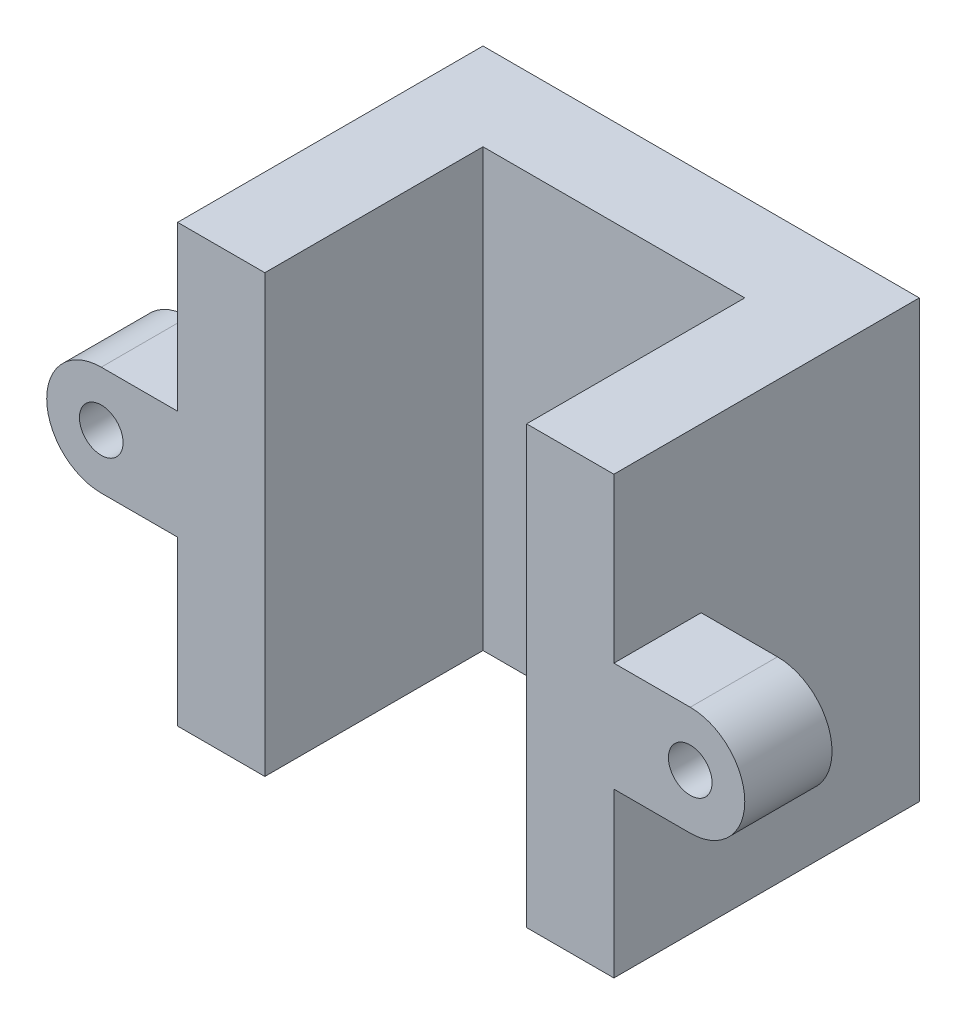
ISO-10303-21;
HEADER;
FILE_DESCRIPTION(('STEP AP214'),'2;1');
FILE_NAME('part.step','',(''),(''),'','','');
FILE_SCHEMA(('AUTOMOTIVE_DESIGN { 1 0 10303 214 1 1 1 1 }'));
ENDSEC;
DATA;
#1=APPLICATION_CONTEXT('core data for automotive mechanical design processes');
#2=APPLICATION_PROTOCOL_DEFINITION('international standard','automotive_design',2000,#1);
#3=PRODUCT_CONTEXT('',#1,'mechanical');
#4=PRODUCT('Part','Part','',(#3));
#5=PRODUCT_RELATED_PRODUCT_CATEGORY('part','',(#4));
#6=PRODUCT_DEFINITION_FORMATION('','',#4);
#7=PRODUCT_DEFINITION_CONTEXT('part definition',#1,'design');
#8=PRODUCT_DEFINITION('design','',#6,#7);
#9=PRODUCT_DEFINITION_SHAPE('','',#8);
#10=(LENGTH_UNIT() NAMED_UNIT(*) SI_UNIT(.MILLI.,.METRE.));
#11=(NAMED_UNIT(*) PLANE_ANGLE_UNIT() SI_UNIT($,.RADIAN.));
#12=(NAMED_UNIT(*) SI_UNIT($,.STERADIAN.) SOLID_ANGLE_UNIT());
#13=UNCERTAINTY_MEASURE_WITH_UNIT(LENGTH_MEASURE(1.E-05),#10,'distance_accuracy_value','');
#14=(GEOMETRIC_REPRESENTATION_CONTEXT(3) GLOBAL_UNCERTAINTY_ASSIGNED_CONTEXT((#13)) GLOBAL_UNIT_ASSIGNED_CONTEXT((#10,
#11,#12)) REPRESENTATION_CONTEXT('',''));
#15=CARTESIAN_POINT('',(0.,0.,0.));
#16=DIRECTION('',(0.,0.,1.));
#17=DIRECTION('',(1.,0.,0.));
#18=AXIS2_PLACEMENT_3D('',#15,#16,#17);
#19=CARTESIAN_POINT('',(-16.,4.,0.999999999999997));
#20=DIRECTION('',(0.,0.,-1.));
#21=DIRECTION('',(0.,1.,0.));
#22=AXIS2_PLACEMENT_3D('',#19,#20,#21);
#23=PLANE('',#22);
#24=CARTESIAN_POINT('',(-13.5,10.,0.999999999999998));
#25=DIRECTION('',(0.,0.,1.));
#26=DIRECTION('',(0.,1.,0.));
#27=AXIS2_PLACEMENT_3D('',#24,#25,#26);
#28=CIRCLE('',#27,2.5);
#29=CARTESIAN_POINT('',(-13.5,12.5,0.999999999999998));
#30=VERTEX_POINT('',#29);
#31=CARTESIAN_POINT('',(-13.5,7.5,0.999999999999998));
#32=VERTEX_POINT('',#31);
#33=EDGE_CURVE('E360',#30,#32,#28,.T.);
#34=ORIENTED_EDGE('',*,*,#33,.F.);
#35=DIRECTION('',(1.,0.,0.));
#36=VECTOR('',#35,1.);
#37=CARTESIAN_POINT('',(0.,12.5,0.999999999999998));
#38=LINE('',#37,#36);
#39=CARTESIAN_POINT('',(-10.,12.5,0.999999999999998));
#40=VERTEX_POINT('',#39);
#41=EDGE_CURVE('E346',#30,#40,#38,.T.);
#42=ORIENTED_EDGE('',*,*,#41,.T.);
#43=DIRECTION('',(0.,1.,0.));
#44=VECTOR('',#43,1.);
#45=CARTESIAN_POINT('',(-10.,4.,0.999999999999997));
#46=LINE('',#45,#44);
#47=CARTESIAN_POINT('',(-10.,7.5,0.999999999999998));
#48=VERTEX_POINT('',#47);
#49=EDGE_CURVE('E374',#48,#40,#46,.T.);
#50=ORIENTED_EDGE('',*,*,#49,.F.);
#51=DIRECTION('',(1.,0.,0.));
#52=VECTOR('',#51,1.);
#53=CARTESIAN_POINT('',(0.,7.5,0.999999999999998));
#54=LINE('',#53,#52);
#55=EDGE_CURVE('E363',#32,#48,#54,.T.);
#56=ORIENTED_EDGE('',*,*,#55,.F.);
#57=EDGE_LOOP('',(#34,#42,#50,#56));
#58=FACE_BOUND('',#57,.T.);
#59=DIRECTION('',(0.,1.,0.));
#60=VECTOR('',#59,1.);
#61=CARTESIAN_POINT('',(-11.9844555433772,9.12500000000001,0.999999999999998));
#62=LINE('',#61,#60);
#63=CARTESIAN_POINT('',(-11.9844555433772,9.12500000000001,0.999999999999998));
#64=VERTEX_POINT('',#63);
#65=CARTESIAN_POINT('',(-11.9844555433772,10.875,0.999999999999998));
#66=VERTEX_POINT('',#65);
#67=EDGE_CURVE('E327',#64,#66,#62,.T.);
#68=ORIENTED_EDGE('',*,*,#67,.T.);
#69=DIRECTION('',(-0.866025403784442,0.499999999999995,0.));
#70=VECTOR('',#69,1.);
#71=CARTESIAN_POINT('',(-11.9844555433772,10.875,0.999999999999998));
#72=LINE('',#71,#70);
#73=CARTESIAN_POINT('',(-13.5,11.75,0.999999999999998));
#74=VERTEX_POINT('',#73);
#75=EDGE_CURVE('E124',#66,#74,#72,.T.);
#76=ORIENTED_EDGE('',*,*,#75,.T.);
#77=DIRECTION('',(-0.866025403784438,-0.500000000000001,0.));
#78=VECTOR('',#77,1.);
#79=CARTESIAN_POINT('',(-13.5,11.75,0.999999999999998));
#80=LINE('',#79,#78);
#81=CARTESIAN_POINT('',(-15.0155444566228,10.875,0.999999999999998));
#82=VERTEX_POINT('',#81);
#83=EDGE_CURVE('E314',#74,#82,#80,.T.);
#84=ORIENTED_EDGE('',*,*,#83,.T.);
#85=DIRECTION('',(0.,-1.,0.));
#86=VECTOR('',#85,1.);
#87=CARTESIAN_POINT('',(-15.0155444566228,10.875,0.999999999999998));
#88=LINE('',#87,#86);
#89=CARTESIAN_POINT('',(-15.0155444566228,9.12499999999999,0.999999999999998));
#90=VERTEX_POINT('',#89);
#91=EDGE_CURVE('E317',#82,#90,#88,.T.);
#92=ORIENTED_EDGE('',*,*,#91,.T.);
#93=DIRECTION('',(0.866025403784441,-0.499999999999996,0.));
#94=VECTOR('',#93,1.);
#95=CARTESIAN_POINT('',(-15.0155444566228,9.12499999999999,0.999999999999998));
#96=LINE('',#95,#94);
#97=CARTESIAN_POINT('',(-13.5,8.25,0.999999999999998));
#98=VERTEX_POINT('',#97);
#99=EDGE_CURVE('E332',#90,#98,#96,.T.);
#100=ORIENTED_EDGE('',*,*,#99,.T.);
#101=DIRECTION('',(0.866025403784434,0.500000000000007,0.));
#102=VECTOR('',#101,1.);
#103=CARTESIAN_POINT('',(-13.5,8.25,0.999999999999998));
#104=LINE('',#103,#102);
#105=EDGE_CURVE('E329',#98,#64,#104,.T.);
#106=ORIENTED_EDGE('',*,*,#105,.T.);
#107=EDGE_LOOP('',(#68,#76,#84,#92,#100,#106));
#108=FACE_BOUND('',#107,.T.);
#109=ADVANCED_FACE('F107',(#58,#108),#23,.T.);
#110=CARTESIAN_POINT('',(-13.5,10.,7.));
#111=DIRECTION('',(0.,0.,-1.));
#112=DIRECTION('',(0.,1.,0.));
#113=AXIS2_PLACEMENT_3D('',#110,#111,#112);
#114=CYLINDRICAL_SURFACE('',#113,1.);
#115=CARTESIAN_POINT('',(-13.5,10.,5.));
#116=DIRECTION('',(0.,0.,1.));
#117=DIRECTION('',(1.,0.,0.));
#118=AXIS2_PLACEMENT_3D('',#115,#116,#117);
#119=CIRCLE('',#118,1.);
#120=CARTESIAN_POINT('',(-12.5,10.,5.));
#121=VERTEX_POINT('',#120);
#122=EDGE_CURVE('E353',#121,#121,#119,.F.);
#123=ORIENTED_EDGE('',*,*,#122,.F.);
#124=EDGE_LOOP('',(#123));
#125=FACE_BOUND('',#124,.T.);
#126=CARTESIAN_POINT('',(-13.5,10.,3.));
#127=DIRECTION('',(0.,0.,-1.));
#128=DIRECTION('',(-1.,0.,0.));
#129=AXIS2_PLACEMENT_3D('',#126,#127,#128);
#130=CIRCLE('',#129,1.);
#131=CARTESIAN_POINT('',(-14.5,10.,3.));
#132=VERTEX_POINT('',#131);
#133=EDGE_CURVE('E111',#132,#132,#130,.T.);
#134=ORIENTED_EDGE('',*,*,#133,.T.);
#135=EDGE_LOOP('',(#134));
#136=FACE_BOUND('',#135,.T.);
#137=ADVANCED_FACE('F538',(#125,#136),#114,.F.);
#138=CARTESIAN_POINT('',(0.,20.,5.));
#139=DIRECTION('',(0.,0.,1.));
#140=DIRECTION('',(1.,0.,0.));
#141=AXIS2_PLACEMENT_3D('',#138,#139,#140);
#142=PLANE('',#141);
#143=ORIENTED_EDGE('',*,*,#122,.T.);
#144=EDGE_LOOP('',(#143));
#145=FACE_BOUND('',#144,.T.);
#146=DIRECTION('',(-1.,0.,0.));
#147=VECTOR('',#146,1.);
#148=CARTESIAN_POINT('',(0.,12.5,5.));
#149=LINE('',#148,#147);
#150=CARTESIAN_POINT('',(-10.,12.5,5.));
#151=VERTEX_POINT('',#150);
#152=CARTESIAN_POINT('',(-13.5,12.5,5.));
#153=VERTEX_POINT('',#152);
#154=EDGE_CURVE('E357',#151,#153,#149,.T.);
#155=ORIENTED_EDGE('',*,*,#154,.T.);
#156=CARTESIAN_POINT('',(-13.5,10.,5.));
#157=DIRECTION('',(0.,0.,1.));
#158=DIRECTION('',(1.,0.,0.));
#159=AXIS2_PLACEMENT_3D('',#156,#157,#158);
#160=CIRCLE('',#159,2.5);
#161=CARTESIAN_POINT('',(-13.5,7.5,5.));
#162=VERTEX_POINT('',#161);
#163=EDGE_CURVE('E369',#162,#153,#160,.F.);
#164=ORIENTED_EDGE('',*,*,#163,.F.);
#165=DIRECTION('',(-1.,0.,0.));
#166=VECTOR('',#165,1.);
#167=CARTESIAN_POINT('',(0.,7.5,5.));
#168=LINE('',#167,#166);
#169=CARTESIAN_POINT('',(-10.,7.5,5.));
#170=VERTEX_POINT('',#169);
#171=EDGE_CURVE('E372',#170,#162,#168,.T.);
#172=ORIENTED_EDGE('',*,*,#171,.F.);
#173=DIRECTION('',(0.,-1.,0.));
#174=VECTOR('',#173,1.);
#175=CARTESIAN_POINT('',(-10.,20.,5.));
#176=LINE('',#175,#174);
#177=CARTESIAN_POINT('',(-10.,0.,5.));
#178=VERTEX_POINT('',#177);
#179=EDGE_CURVE('E478',#170,#178,#176,.T.);
#180=ORIENTED_EDGE('',*,*,#179,.T.);
#181=DIRECTION('',(-1.,0.,0.));
#182=VECTOR('',#181,1.);
#183=CARTESIAN_POINT('',(0.,0.,5.));
#184=LINE('',#183,#182);
#185=CARTESIAN_POINT('',(-6.,0.,5.));
#186=VERTEX_POINT('',#185);
#187=EDGE_CURVE('E456',#186,#178,#184,.T.);
#188=ORIENTED_EDGE('',*,*,#187,.F.);
#189=DIRECTION('',(0.,-1.,0.));
#190=VECTOR('',#189,1.);
#191=CARTESIAN_POINT('',(-6.,20.,5.));
#192=LINE('',#191,#190);
#193=CARTESIAN_POINT('',(-6.,20.,5.));
#194=VERTEX_POINT('',#193);
#195=EDGE_CURVE('E12',#194,#186,#192,.T.);
#196=ORIENTED_EDGE('',*,*,#195,.F.);
#197=DIRECTION('',(-1.,0.,0.));
#198=VECTOR('',#197,1.);
#199=CARTESIAN_POINT('',(0.,20.,5.));
#200=LINE('',#199,#198);
#201=CARTESIAN_POINT('',(-10.,20.,5.));
#202=VERTEX_POINT('',#201);
#203=EDGE_CURVE('E457',#194,#202,#200,.T.);
#204=ORIENTED_EDGE('',*,*,#203,.T.);
#205=EDGE_CURVE('E500',#202,#151,#176,.T.);
#206=ORIENTED_EDGE('',*,*,#205,.T.);
#207=EDGE_LOOP('',(#155,#164,#172,#180,#188,#196,#204,#206));
#208=FACE_BOUND('',#207,.T.);
#209=ADVANCED_FACE('F109',(#145,#208),#142,.T.);
#210=CARTESIAN_POINT('',(-10.,20.,0.));
#211=DIRECTION('',(-1.,0.,0.));
#212=DIRECTION('',(0.,0.,1.));
#213=AXIS2_PLACEMENT_3D('',#210,#211,#212);
#214=PLANE('',#213);
#215=DIRECTION('',(0.,0.,-1.));
#216=VECTOR('',#215,1.);
#217=CARTESIAN_POINT('',(-10.,7.5,7.));
#218=LINE('',#217,#216);
#219=EDGE_CURVE('E367',#170,#48,#218,.T.);
#220=ORIENTED_EDGE('',*,*,#219,.T.);
#221=ORIENTED_EDGE('',*,*,#49,.T.);
#222=DIRECTION('',(0.,0.,-1.));
#223=VECTOR('',#222,1.);
#224=CARTESIAN_POINT('',(-10.,12.5,7.));
#225=LINE('',#224,#223);
#226=EDGE_CURVE('E349',#151,#40,#225,.T.);
#227=ORIENTED_EDGE('',*,*,#226,.F.);
#228=ORIENTED_EDGE('',*,*,#205,.F.);
#229=DIRECTION('',(0.,0.,-1.));
#230=VECTOR('',#229,1.);
#231=CARTESIAN_POINT('',(-10.,20.,0.));
#232=LINE('',#231,#230);
#233=CARTESIAN_POINT('',(-10.,20.,-9.));
#234=VERTEX_POINT('',#233);
#235=EDGE_CURVE('E475',#202,#234,#232,.T.);
#236=ORIENTED_EDGE('',*,*,#235,.T.);
#237=DIRECTION('',(0.,-1.,0.));
#238=VECTOR('',#237,1.);
#239=CARTESIAN_POINT('',(-10.,20.,-9.));
#240=LINE('',#239,#238);
#241=CARTESIAN_POINT('',(-10.,0.,-9.));
#242=VERTEX_POINT('',#241);
#243=EDGE_CURVE('E502',#234,#242,#240,.T.);
#244=ORIENTED_EDGE('',*,*,#243,.T.);
#245=DIRECTION('',(0.,0.,-1.));
#246=VECTOR('',#245,1.);
#247=CARTESIAN_POINT('',(-10.,0.,0.));
#248=LINE('',#247,#246);
#249=EDGE_CURVE('E461',#178,#242,#248,.T.);
#250=ORIENTED_EDGE('',*,*,#249,.F.);
#251=ORIENTED_EDGE('',*,*,#179,.F.);
#252=EDGE_LOOP('',(#220,#221,#227,#228,#236,#244,#250,#251));
#253=FACE_BOUND('',#252,.T.);
#254=ADVANCED_FACE('F522',(#253),#214,.T.);
#255=CARTESIAN_POINT('',(13.5,10.,7.));
#256=DIRECTION('',(0.,0.,-1.));
#257=DIRECTION('',(0.,1.,0.));
#258=AXIS2_PLACEMENT_3D('',#255,#256,#257);
#259=CYLINDRICAL_SURFACE('',#258,1.);
#260=CARTESIAN_POINT('',(13.5,10.,5.));
#261=DIRECTION('',(0.,0.,-1.));
#262=DIRECTION('',(-1.,0.,0.));
#263=AXIS2_PLACEMENT_3D('',#260,#261,#262);
#264=CIRCLE('',#263,1.);
#265=CARTESIAN_POINT('',(12.5,10.,5.));
#266=VERTEX_POINT('',#265);
#267=EDGE_CURVE('E435',#266,#266,#264,.T.);
#268=ORIENTED_EDGE('',*,*,#267,.F.);
#269=EDGE_LOOP('',(#268));
#270=FACE_BOUND('',#269,.T.);
#271=CARTESIAN_POINT('',(13.5,10.,3.));
#272=DIRECTION('',(0.,0.,-1.));
#273=DIRECTION('',(-1.,0.,0.));
#274=AXIS2_PLACEMENT_3D('',#271,#272,#273);
#275=CIRCLE('',#274,1.);
#276=CARTESIAN_POINT('',(12.5,10.,3.));
#277=VERTEX_POINT('',#276);
#278=EDGE_CURVE('E414',#277,#277,#275,.F.);
#279=ORIENTED_EDGE('',*,*,#278,.F.);
#280=EDGE_LOOP('',(#279));
#281=FACE_BOUND('',#280,.T.);
#282=ADVANCED_FACE('F519',(#270,#281),#259,.F.);
#283=CARTESIAN_POINT('',(0.,20.,5.));
#284=DIRECTION('',(0.,0.,-1.));
#285=DIRECTION('',(-1.,0.,0.));
#286=AXIS2_PLACEMENT_3D('',#283,#284,#285);
#287=PLANE('',#286);
#288=ORIENTED_EDGE('',*,*,#267,.T.);
#289=EDGE_LOOP('',(#288));
#290=FACE_BOUND('',#289,.T.);
#291=CARTESIAN_POINT('',(13.5,10.,5.));
#292=DIRECTION('',(0.,0.,-1.));
#293=DIRECTION('',(-1.,0.,0.));
#294=AXIS2_PLACEMENT_3D('',#291,#292,#293);
#295=CIRCLE('',#294,2.5);
#296=CARTESIAN_POINT('',(13.5,12.5,5.));
#297=VERTEX_POINT('',#296);
#298=CARTESIAN_POINT('',(13.5,7.5,5.));
#299=VERTEX_POINT('',#298);
#300=EDGE_CURVE('E447',#297,#299,#295,.T.);
#301=ORIENTED_EDGE('',*,*,#300,.F.);
#302=DIRECTION('',(-1.,0.,0.));
#303=VECTOR('',#302,1.);
#304=CARTESIAN_POINT('',(0.,12.5,5.));
#305=LINE('',#304,#303);
#306=CARTESIAN_POINT('',(10.,12.5,5.));
#307=VERTEX_POINT('',#306);
#308=EDGE_CURVE('E430',#297,#307,#305,.T.);
#309=ORIENTED_EDGE('',*,*,#308,.T.);
#310=DIRECTION('',(0.,-1.,0.));
#311=VECTOR('',#310,1.);
#312=CARTESIAN_POINT('',(10.,20.,5.));
#313=LINE('',#312,#311);
#314=CARTESIAN_POINT('',(10.,20.,5.));
#315=VERTEX_POINT('',#314);
#316=EDGE_CURVE('E507',#315,#307,#313,.T.);
#317=ORIENTED_EDGE('',*,*,#316,.F.);
#318=DIRECTION('',(1.,0.,0.));
#319=VECTOR('',#318,1.);
#320=CARTESIAN_POINT('',(0.,20.,5.));
#321=LINE('',#320,#319);
#322=CARTESIAN_POINT('',(6.,20.,5.));
#323=VERTEX_POINT('',#322);
#324=EDGE_CURVE('E468',#323,#315,#321,.T.);
#325=ORIENTED_EDGE('',*,*,#324,.F.);
#326=DIRECTION('',(0.,-1.,0.));
#327=VECTOR('',#326,1.);
#328=CARTESIAN_POINT('',(6.,20.,5.));
#329=LINE('',#328,#327);
#330=CARTESIAN_POINT('',(6.,0.,5.));
#331=VERTEX_POINT('',#330);
#332=EDGE_CURVE('E509',#323,#331,#329,.T.);
#333=ORIENTED_EDGE('',*,*,#332,.T.);
#334=DIRECTION('',(1.,0.,0.));
#335=VECTOR('',#334,1.);
#336=CARTESIAN_POINT('',(0.,0.,5.));
#337=LINE('',#336,#335);
#338=CARTESIAN_POINT('',(10.,0.,5.));
#339=VERTEX_POINT('',#338);
#340=EDGE_CURVE('E489',#331,#339,#337,.T.);
#341=ORIENTED_EDGE('',*,*,#340,.T.);
#342=CARTESIAN_POINT('',(10.,7.5,5.));
#343=VERTEX_POINT('',#342);
#344=EDGE_CURVE('E506',#343,#339,#313,.T.);
#345=ORIENTED_EDGE('',*,*,#344,.F.);
#346=DIRECTION('',(-1.,0.,0.));
#347=VECTOR('',#346,1.);
#348=CARTESIAN_POINT('',(0.,7.5,5.));
#349=LINE('',#348,#347);
#350=EDGE_CURVE('E450',#299,#343,#349,.T.);
#351=ORIENTED_EDGE('',*,*,#350,.F.);
#352=EDGE_LOOP('',(#301,#309,#317,#325,#333,#341,#345,#351));
#353=FACE_BOUND('',#352,.T.);
#354=ADVANCED_FACE('F521',(#290,#353),#287,.F.);
#355=CARTESIAN_POINT('',(16.,4.,0.999999999999997));
#356=DIRECTION('',(0.,0.,1.));
#357=DIRECTION('',(0.,-1.,0.));
#358=AXIS2_PLACEMENT_3D('',#355,#356,#357);
#359=PLANE('',#358);
#360=DIRECTION('',(0.866025403784438,-0.500000000000001,0.));
#361=VECTOR('',#360,1.);
#362=CARTESIAN_POINT('',(13.5,11.75,0.999999999999998));
#363=LINE('',#362,#361);
#364=CARTESIAN_POINT('',(13.5,11.75,0.999999999999997));
#365=VERTEX_POINT('',#364);
#366=CARTESIAN_POINT('',(15.0155444566228,10.875,0.999999999999998));
#367=VERTEX_POINT('',#366);
#368=EDGE_CURVE('E398',#365,#367,#363,.T.);
#369=ORIENTED_EDGE('',*,*,#368,.F.);
#370=DIRECTION('',(0.866025403784442,0.499999999999995,0.));
#371=VECTOR('',#370,1.);
#372=CARTESIAN_POINT('',(11.9844555433772,10.875,0.999999999999998));
#373=LINE('',#372,#371);
#374=CARTESIAN_POINT('',(11.9844555433772,10.875,0.999999999999998));
#375=VERTEX_POINT('',#374);
#376=EDGE_CURVE('E132',#375,#365,#373,.T.);
#377=ORIENTED_EDGE('',*,*,#376,.F.);
#378=DIRECTION('',(0.,1.,0.));
#379=VECTOR('',#378,1.);
#380=CARTESIAN_POINT('',(11.9844555433772,9.12500000000001,0.999999999999998));
#381=LINE('',#380,#379);
#382=CARTESIAN_POINT('',(11.9844555433772,9.12500000000001,0.999999999999998));
#383=VERTEX_POINT('',#382);
#384=EDGE_CURVE('E381',#383,#375,#381,.T.);
#385=ORIENTED_EDGE('',*,*,#384,.F.);
#386=DIRECTION('',(-0.866025403784434,0.500000000000007,0.));
#387=VECTOR('',#386,1.);
#388=CARTESIAN_POINT('',(13.5,8.25,0.999999999999998));
#389=LINE('',#388,#387);
#390=CARTESIAN_POINT('',(13.5,8.25,0.999999999999998));
#391=VERTEX_POINT('',#390);
#392=EDGE_CURVE('E407',#391,#383,#389,.T.);
#393=ORIENTED_EDGE('',*,*,#392,.F.);
#394=DIRECTION('',(-0.866025403784441,-0.499999999999996,0.));
#395=VECTOR('',#394,1.);
#396=CARTESIAN_POINT('',(15.0155444566228,9.12499999999999,0.999999999999998));
#397=LINE('',#396,#395);
#398=CARTESIAN_POINT('',(15.0155444566228,9.12499999999999,0.999999999999998));
#399=VERTEX_POINT('',#398);
#400=EDGE_CURVE('E404',#399,#391,#397,.T.);
#401=ORIENTED_EDGE('',*,*,#400,.F.);
#402=DIRECTION('',(0.,-1.,0.));
#403=VECTOR('',#402,1.);
#404=CARTESIAN_POINT('',(15.0155444566228,10.875,0.999999999999998));
#405=LINE('',#404,#403);
#406=EDGE_CURVE('E401',#367,#399,#405,.T.);
#407=ORIENTED_EDGE('',*,*,#406,.F.);
#408=EDGE_LOOP('',(#369,#377,#385,#393,#401,#407));
#409=FACE_BOUND('',#408,.T.);
#410=DIRECTION('',(-1.,0.,0.));
#411=VECTOR('',#410,1.);
#412=CARTESIAN_POINT('',(0.,12.5,0.999999999999998));
#413=LINE('',#412,#411);
#414=CARTESIAN_POINT('',(13.5,12.5,0.999999999999998));
#415=VERTEX_POINT('',#414);
#416=CARTESIAN_POINT('',(10.,12.5,0.999999999999998));
#417=VERTEX_POINT('',#416);
#418=EDGE_CURVE('E424',#415,#417,#413,.T.);
#419=ORIENTED_EDGE('',*,*,#418,.F.);
#420=CARTESIAN_POINT('',(13.5,10.,0.999999999999998));
#421=DIRECTION('',(0.,0.,-1.));
#422=DIRECTION('',(0.,1.,0.));
#423=AXIS2_PLACEMENT_3D('',#420,#421,#422);
#424=CIRCLE('',#423,2.5);
#425=CARTESIAN_POINT('',(13.5,7.5,0.999999999999998));
#426=VERTEX_POINT('',#425);
#427=EDGE_CURVE('E438',#415,#426,#424,.T.);
#428=ORIENTED_EDGE('',*,*,#427,.T.);
#429=DIRECTION('',(-1.,0.,0.));
#430=VECTOR('',#429,1.);
#431=CARTESIAN_POINT('',(0.,7.5,0.999999999999998));
#432=LINE('',#431,#430);
#433=CARTESIAN_POINT('',(10.,7.5,0.999999999999998));
#434=VERTEX_POINT('',#433);
#435=EDGE_CURVE('E441',#426,#434,#432,.T.);
#436=ORIENTED_EDGE('',*,*,#435,.T.);
#437=DIRECTION('',(0.,1.,0.));
#438=VECTOR('',#437,1.);
#439=CARTESIAN_POINT('',(10.,4.,0.999999999999997));
#440=LINE('',#439,#438);
#441=EDGE_CURVE('E453',#434,#417,#440,.T.);
#442=ORIENTED_EDGE('',*,*,#441,.T.);
#443=EDGE_LOOP('',(#419,#428,#436,#442));
#444=FACE_BOUND('',#443,.T.);
#445=ADVANCED_FACE('F529',(#409,#444),#359,.F.);
#446=CARTESIAN_POINT('',(10.,20.,0.));
#447=DIRECTION('',(-1.,0.,0.));
#448=DIRECTION('',(0.,0.,1.));
#449=AXIS2_PLACEMENT_3D('',#446,#447,#448);
#450=PLANE('',#449);
#451=ORIENTED_EDGE('',*,*,#441,.F.);
#452=DIRECTION('',(0.,0.,-1.));
#453=VECTOR('',#452,1.);
#454=CARTESIAN_POINT('',(10.,7.5,7.));
#455=LINE('',#454,#453);
#456=EDGE_CURVE('E444',#343,#434,#455,.T.);
#457=ORIENTED_EDGE('',*,*,#456,.F.);
#458=ORIENTED_EDGE('',*,*,#344,.T.);
#459=DIRECTION('',(0.,0.,-1.));
#460=VECTOR('',#459,1.);
#461=CARTESIAN_POINT('',(10.,0.,0.));
#462=LINE('',#461,#460);
#463=CARTESIAN_POINT('',(10.,0.,-9.));
#464=VERTEX_POINT('',#463);
#465=EDGE_CURVE('E492',#339,#464,#462,.T.);
#466=ORIENTED_EDGE('',*,*,#465,.T.);
#467=DIRECTION('',(0.,-1.,0.));
#468=VECTOR('',#467,1.);
#469=CARTESIAN_POINT('',(10.,20.,-9.));
#470=LINE('',#469,#468);
#471=CARTESIAN_POINT('',(10.,20.,-9.));
#472=VERTEX_POINT('',#471);
#473=EDGE_CURVE('E504',#472,#464,#470,.T.);
#474=ORIENTED_EDGE('',*,*,#473,.F.);
#475=DIRECTION('',(0.,0.,-1.));
#476=VECTOR('',#475,1.);
#477=CARTESIAN_POINT('',(10.,20.,0.));
#478=LINE('',#477,#476);
#479=EDGE_CURVE('E470',#315,#472,#478,.T.);
#480=ORIENTED_EDGE('',*,*,#479,.F.);
#481=ORIENTED_EDGE('',*,*,#316,.T.);
#482=DIRECTION('',(0.,0.,-1.));
#483=VECTOR('',#482,1.);
#484=CARTESIAN_POINT('',(10.,12.5,7.));
#485=LINE('',#484,#483);
#486=EDGE_CURVE('E428',#307,#417,#485,.T.);
#487=ORIENTED_EDGE('',*,*,#486,.T.);
#488=EDGE_LOOP('',(#451,#457,#458,#466,#474,#480,#481,#487));
#489=FACE_BOUND('',#488,.T.);
#490=ADVANCED_FACE('F595',(#489),#450,.F.);
#491=CARTESIAN_POINT('',(-6.,20.,0.));
#492=DIRECTION('',(-1.,0.,0.));
#493=DIRECTION('',(0.,0.,1.));
#494=AXIS2_PLACEMENT_3D('',#491,#492,#493);
#495=PLANE('',#494);
#496=DIRECTION('',(0.,0.,-1.));
#497=VECTOR('',#496,1.);
#498=CARTESIAN_POINT('',(-6.,0.,0.));
#499=LINE('',#498,#497);
#500=CARTESIAN_POINT('',(-6.,0.,-5.));
#501=VERTEX_POINT('',#500);
#502=EDGE_CURVE('E481',#186,#501,#499,.T.);
#503=ORIENTED_EDGE('',*,*,#502,.T.);
#504=DIRECTION('',(0.,-1.,0.));
#505=VECTOR('',#504,1.);
#506=CARTESIAN_POINT('',(-6.,20.,-5.));
#507=LINE('',#506,#505);
#508=CARTESIAN_POINT('',(-6.,20.,-5.));
#509=VERTEX_POINT('',#508);
#510=EDGE_CURVE('E116',#509,#501,#507,.T.);
#511=ORIENTED_EDGE('',*,*,#510,.F.);
#512=DIRECTION('',(0.,0.,-1.));
#513=VECTOR('',#512,1.);
#514=CARTESIAN_POINT('',(-6.,20.,0.));
#515=LINE('',#514,#513);
#516=EDGE_CURVE('E460',#194,#509,#515,.T.);
#517=ORIENTED_EDGE('',*,*,#516,.F.);
#518=ORIENTED_EDGE('',*,*,#195,.T.);
#519=EDGE_LOOP('',(#503,#511,#517,#518));
#520=FACE_BOUND('',#519,.T.);
#521=ADVANCED_FACE('F624',(#520),#495,.F.);
#522=CARTESIAN_POINT('',(0.,20.,-5.));
#523=DIRECTION('',(0.,0.,-1.));
#524=DIRECTION('',(-1.,0.,0.));
#525=AXIS2_PLACEMENT_3D('',#522,#523,#524);
#526=PLANE('',#525);
#527=DIRECTION('',(1.,0.,0.));
#528=VECTOR('',#527,1.);
#529=CARTESIAN_POINT('',(0.,0.,-5.));
#530=LINE('',#529,#528);
#531=CARTESIAN_POINT('',(6.,0.,-5.));
#532=VERTEX_POINT('',#531);
#533=EDGE_CURVE('E483',#501,#532,#530,.T.);
#534=ORIENTED_EDGE('',*,*,#533,.T.);
#535=DIRECTION('',(0.,-1.,0.));
#536=VECTOR('',#535,1.);
#537=CARTESIAN_POINT('',(6.,20.,-5.));
#538=LINE('',#537,#536);
#539=CARTESIAN_POINT('',(6.,20.,-5.));
#540=VERTEX_POINT('',#539);
#541=EDGE_CURVE('E511',#540,#532,#538,.T.);
#542=ORIENTED_EDGE('',*,*,#541,.F.);
#543=DIRECTION('',(1.,0.,0.));
#544=VECTOR('',#543,1.);
#545=CARTESIAN_POINT('',(0.,20.,-5.));
#546=LINE('',#545,#544);
#547=EDGE_CURVE('E463',#509,#540,#546,.T.);
#548=ORIENTED_EDGE('',*,*,#547,.F.);
#549=ORIENTED_EDGE('',*,*,#510,.T.);
#550=EDGE_LOOP('',(#534,#542,#548,#549));
#551=FACE_BOUND('',#550,.T.);
#552=ADVANCED_FACE('F628',(#551),#526,.F.);
#553=CARTESIAN_POINT('',(6.,20.,0.));
#554=DIRECTION('',(-1.,0.,0.));
#555=DIRECTION('',(0.,0.,1.));
#556=AXIS2_PLACEMENT_3D('',#553,#554,#555);
#557=PLANE('',#556);
#558=DIRECTION('',(0.,0.,-1.));
#559=VECTOR('',#558,1.);
#560=CARTESIAN_POINT('',(6.,0.,0.));
#561=LINE('',#560,#559);
#562=EDGE_CURVE('E486',#331,#532,#561,.T.);
#563=ORIENTED_EDGE('',*,*,#562,.F.);
#564=ORIENTED_EDGE('',*,*,#332,.F.);
#565=DIRECTION('',(0.,0.,-1.));
#566=VECTOR('',#565,1.);
#567=CARTESIAN_POINT('',(6.,20.,0.));
#568=LINE('',#567,#566);
#569=EDGE_CURVE('E465',#323,#540,#568,.T.);
#570=ORIENTED_EDGE('',*,*,#569,.T.);
#571=ORIENTED_EDGE('',*,*,#541,.T.);
#572=EDGE_LOOP('',(#563,#564,#570,#571));
#573=FACE_BOUND('',#572,.T.);
#574=ADVANCED_FACE('F621',(#573),#557,.T.);
#575=CARTESIAN_POINT('',(0.,20.,-9.));
#576=DIRECTION('',(0.,0.,-1.));
#577=DIRECTION('',(-1.,0.,0.));
#578=AXIS2_PLACEMENT_3D('',#575,#576,#577);
#579=PLANE('',#578);
#580=DIRECTION('',(1.,0.,0.));
#581=VECTOR('',#580,1.);
#582=CARTESIAN_POINT('',(0.,0.,-9.));
#583=LINE('',#582,#581);
#584=EDGE_CURVE('E495',#242,#464,#583,.T.);
#585=ORIENTED_EDGE('',*,*,#584,.F.);
#586=ORIENTED_EDGE('',*,*,#243,.F.);
#587=DIRECTION('',(1.,0.,0.));
#588=VECTOR('',#587,1.);
#589=CARTESIAN_POINT('',(0.,20.,-9.));
#590=LINE('',#589,#588);
#591=EDGE_CURVE('E472',#234,#472,#590,.T.);
#592=ORIENTED_EDGE('',*,*,#591,.T.);
#593=ORIENTED_EDGE('',*,*,#473,.T.);
#594=EDGE_LOOP('',(#585,#586,#592,#593));
#595=FACE_BOUND('',#594,.T.);
#596=ADVANCED_FACE('F616',(#595),#579,.T.);
#597=CARTESIAN_POINT('',(0.,20.,0.));
#598=DIRECTION('',(0.,1.,0.));
#599=DIRECTION('',(0.,0.,1.));
#600=AXIS2_PLACEMENT_3D('',#597,#598,#599);
#601=PLANE('',#600);
#602=ORIENTED_EDGE('',*,*,#203,.F.);
#603=ORIENTED_EDGE('',*,*,#516,.T.);
#604=ORIENTED_EDGE('',*,*,#547,.T.);
#605=ORIENTED_EDGE('',*,*,#569,.F.);
#606=ORIENTED_EDGE('',*,*,#324,.T.);
#607=ORIENTED_EDGE('',*,*,#479,.T.);
#608=ORIENTED_EDGE('',*,*,#591,.F.);
#609=ORIENTED_EDGE('',*,*,#235,.F.);
#610=EDGE_LOOP('',(#602,#603,#604,#605,#606,#607,#608,#609));
#611=FACE_BOUND('',#610,.T.);
#612=ADVANCED_FACE('F608',(#611),#601,.T.);
#613=CARTESIAN_POINT('',(0.,0.,0.));
#614=DIRECTION('',(0.,1.,0.));
#615=DIRECTION('',(0.,0.,1.));
#616=AXIS2_PLACEMENT_3D('',#613,#614,#615);
#617=PLANE('',#616);
#618=ORIENTED_EDGE('',*,*,#187,.T.);
#619=ORIENTED_EDGE('',*,*,#249,.T.);
#620=ORIENTED_EDGE('',*,*,#584,.T.);
#621=ORIENTED_EDGE('',*,*,#465,.F.);
#622=ORIENTED_EDGE('',*,*,#340,.F.);
#623=ORIENTED_EDGE('',*,*,#562,.T.);
#624=ORIENTED_EDGE('',*,*,#533,.F.);
#625=ORIENTED_EDGE('',*,*,#502,.F.);
#626=EDGE_LOOP('',(#618,#619,#620,#621,#622,#623,#624,#625));
#627=FACE_BOUND('',#626,.T.);
#628=ADVANCED_FACE('F604',(#627),#617,.F.);
#629=CARTESIAN_POINT('',(0.,7.5,7.));
#630=DIRECTION('',(0.,-1.,0.));
#631=DIRECTION('',(0.,0.,-1.));
#632=AXIS2_PLACEMENT_3D('',#629,#630,#631);
#633=PLANE('',#632);
#634=ORIENTED_EDGE('',*,*,#350,.T.);
#635=ORIENTED_EDGE('',*,*,#456,.T.);
#636=ORIENTED_EDGE('',*,*,#435,.F.);
#637=DIRECTION('',(0.,0.,-1.));
#638=VECTOR('',#637,1.);
#639=CARTESIAN_POINT('',(13.5,7.5,7.));
#640=LINE('',#639,#638);
#641=EDGE_CURVE('E445',#299,#426,#640,.T.);
#642=ORIENTED_EDGE('',*,*,#641,.F.);
#643=EDGE_LOOP('',(#634,#635,#636,#642));
#644=FACE_BOUND('',#643,.T.);
#645=ADVANCED_FACE('F583',(#644),#633,.T.);
#646=CARTESIAN_POINT('',(13.5,10.,7.));
#647=DIRECTION('',(0.,0.,-1.));
#648=DIRECTION('',(0.,1.,0.));
#649=AXIS2_PLACEMENT_3D('',#646,#647,#648);
#650=CYLINDRICAL_SURFACE('',#649,2.5);
#651=ORIENTED_EDGE('',*,*,#300,.T.);
#652=ORIENTED_EDGE('',*,*,#641,.T.);
#653=ORIENTED_EDGE('',*,*,#427,.F.);
#654=DIRECTION('',(0.,0.,-1.));
#655=VECTOR('',#654,1.);
#656=CARTESIAN_POINT('',(13.5,12.5,7.));
#657=LINE('',#656,#655);
#658=EDGE_CURVE('E427',#297,#415,#657,.T.);
#659=ORIENTED_EDGE('',*,*,#658,.F.);
#660=EDGE_LOOP('',(#651,#652,#653,#659));
#661=FACE_BOUND('',#660,.T.);
#662=ADVANCED_FACE('F578',(#661),#650,.T.);
#663=CARTESIAN_POINT('',(0.,12.5,7.));
#664=DIRECTION('',(0.,-1.,0.));
#665=DIRECTION('',(0.,0.,-1.));
#666=AXIS2_PLACEMENT_3D('',#663,#664,#665);
#667=PLANE('',#666);
#668=ORIENTED_EDGE('',*,*,#658,.T.);
#669=ORIENTED_EDGE('',*,*,#418,.T.);
#670=ORIENTED_EDGE('',*,*,#486,.F.);
#671=ORIENTED_EDGE('',*,*,#308,.F.);
#672=EDGE_LOOP('',(#668,#669,#670,#671));
#673=FACE_BOUND('',#672,.T.);
#674=ADVANCED_FACE('F554',(#673),#667,.F.);
#675=CARTESIAN_POINT('',(0.,0.,3.));
#676=DIRECTION('',(0.,0.,-1.));
#677=DIRECTION('',(-1.,0.,0.));
#678=AXIS2_PLACEMENT_3D('',#675,#676,#677);
#679=PLANE('',#678);
#680=DIRECTION('',(0.866025403784442,0.499999999999995,0.));
#681=VECTOR('',#680,1.);
#682=CARTESIAN_POINT('',(11.9844555433772,10.875,3.));
#683=LINE('',#682,#681);
#684=CARTESIAN_POINT('',(11.9844555433772,10.875,3.));
#685=VERTEX_POINT('',#684);
#686=CARTESIAN_POINT('',(13.5,11.75,3.));
#687=VERTEX_POINT('',#686);
#688=EDGE_CURVE('E377',#685,#687,#683,.T.);
#689=ORIENTED_EDGE('',*,*,#688,.T.);
#690=DIRECTION('',(0.866025403784438,-0.500000000000001,0.));
#691=VECTOR('',#690,1.);
#692=CARTESIAN_POINT('',(13.5,11.75,3.));
#693=LINE('',#692,#691);
#694=CARTESIAN_POINT('',(15.0155444566228,10.875,3.));
#695=VERTEX_POINT('',#694);
#696=EDGE_CURVE('E380',#687,#695,#693,.T.);
#697=ORIENTED_EDGE('',*,*,#696,.T.);
#698=DIRECTION('',(0.,-1.,0.));
#699=VECTOR('',#698,1.);
#700=CARTESIAN_POINT('',(15.0155444566228,10.875,3.));
#701=LINE('',#700,#699);
#702=CARTESIAN_POINT('',(15.0155444566228,9.12499999999999,3.));
#703=VERTEX_POINT('',#702);
#704=EDGE_CURVE('E384',#695,#703,#701,.T.);
#705=ORIENTED_EDGE('',*,*,#704,.T.);
#706=DIRECTION('',(-0.866025403784441,-0.499999999999996,0.));
#707=VECTOR('',#706,1.);
#708=CARTESIAN_POINT('',(15.0155444566228,9.12499999999999,3.));
#709=LINE('',#708,#707);
#710=CARTESIAN_POINT('',(13.5,8.25,3.));
#711=VERTEX_POINT('',#710);
#712=EDGE_CURVE('E387',#703,#711,#709,.T.);
#713=ORIENTED_EDGE('',*,*,#712,.T.);
#714=DIRECTION('',(-0.866025403784434,0.500000000000007,0.));
#715=VECTOR('',#714,1.);
#716=CARTESIAN_POINT('',(13.5,8.25,3.));
#717=LINE('',#716,#715);
#718=CARTESIAN_POINT('',(11.9844555433772,9.12500000000001,3.));
#719=VERTEX_POINT('',#718);
#720=EDGE_CURVE('E390',#711,#719,#717,.T.);
#721=ORIENTED_EDGE('',*,*,#720,.T.);
#722=DIRECTION('',(0.,1.,0.));
#723=VECTOR('',#722,1.);
#724=CARTESIAN_POINT('',(11.9844555433772,9.12500000000001,3.));
#725=LINE('',#724,#723);
#726=EDGE_CURVE('E393',#719,#685,#725,.T.);
#727=ORIENTED_EDGE('',*,*,#726,.T.);
#728=EDGE_LOOP('',(#689,#697,#705,#713,#721,#727));
#729=FACE_BOUND('',#728,.T.);
#730=ORIENTED_EDGE('',*,*,#278,.T.);
#731=EDGE_LOOP('',(#730));
#732=FACE_BOUND('',#731,.T.);
#733=ADVANCED_FACE('F517',(#729,#732),#679,.T.);
#734=CARTESIAN_POINT('',(11.9844555433772,10.875,3.));
#735=DIRECTION('',(-0.499999999999995,0.866025403784442,0.));
#736=DIRECTION('',(-0.866025403784442,-0.499999999999995,0.));
#737=AXIS2_PLACEMENT_3D('',#734,#735,#736);
#738=PLANE('',#737);
#739=ORIENTED_EDGE('',*,*,#376,.T.);
#740=DIRECTION('',(0.,0.,-1.));
#741=VECTOR('',#740,1.);
#742=CARTESIAN_POINT('',(13.5,11.75,3.));
#743=LINE('',#742,#741);
#744=EDGE_CURVE('E396',#687,#365,#743,.T.);
#745=ORIENTED_EDGE('',*,*,#744,.F.);
#746=ORIENTED_EDGE('',*,*,#688,.F.);
#747=DIRECTION('',(0.,0.,-1.));
#748=VECTOR('',#747,1.);
#749=CARTESIAN_POINT('',(11.9844555433772,10.875,3.));
#750=LINE('',#749,#748);
#751=EDGE_CURVE('E412',#685,#375,#750,.T.);
#752=ORIENTED_EDGE('',*,*,#751,.T.);
#753=EDGE_LOOP('',(#739,#745,#746,#752));
#754=FACE_BOUND('',#753,.T.);
#755=ADVANCED_FACE('F553',(#754),#738,.F.);
#756=CARTESIAN_POINT('',(11.9844555433772,9.12500000000001,3.));
#757=DIRECTION('',(-1.,0.,0.));
#758=DIRECTION('',(0.,-1.,0.));
#759=AXIS2_PLACEMENT_3D('',#756,#757,#758);
#760=PLANE('',#759);
#761=ORIENTED_EDGE('',*,*,#384,.T.);
#762=ORIENTED_EDGE('',*,*,#751,.F.);
#763=ORIENTED_EDGE('',*,*,#726,.F.);
#764=DIRECTION('',(0.,0.,-1.));
#765=VECTOR('',#764,1.);
#766=CARTESIAN_POINT('',(11.9844555433772,9.12500000000001,3.));
#767=LINE('',#766,#765);
#768=EDGE_CURVE('E415',#719,#383,#767,.T.);
#769=ORIENTED_EDGE('',*,*,#768,.T.);
#770=EDGE_LOOP('',(#761,#762,#763,#769));
#771=FACE_BOUND('',#770,.T.);
#772=ADVANCED_FACE('F556',(#771),#760,.F.);
#773=CARTESIAN_POINT('',(13.5,8.25,3.));
#774=DIRECTION('',(-0.500000000000007,-0.866025403784434,0.));
#775=DIRECTION('',(0.866025403784434,-0.500000000000007,0.));
#776=AXIS2_PLACEMENT_3D('',#773,#774,#775);
#777=PLANE('',#776);
#778=ORIENTED_EDGE('',*,*,#392,.T.);
#779=ORIENTED_EDGE('',*,*,#768,.F.);
#780=ORIENTED_EDGE('',*,*,#720,.F.);
#781=DIRECTION('',(0.,0.,-1.));
#782=VECTOR('',#781,1.);
#783=CARTESIAN_POINT('',(13.5,8.25,3.));
#784=LINE('',#783,#782);
#785=EDGE_CURVE('E417',#711,#391,#784,.T.);
#786=ORIENTED_EDGE('',*,*,#785,.T.);
#787=EDGE_LOOP('',(#778,#779,#780,#786));
#788=FACE_BOUND('',#787,.T.);
#789=ADVANCED_FACE('F559',(#788),#777,.F.);
#790=CARTESIAN_POINT('',(15.0155444566228,9.12499999999999,3.));
#791=DIRECTION('',(0.499999999999996,-0.866025403784441,0.));
#792=DIRECTION('',(0.866025403784441,0.499999999999996,0.));
#793=AXIS2_PLACEMENT_3D('',#790,#791,#792);
#794=PLANE('',#793);
#795=ORIENTED_EDGE('',*,*,#400,.T.);
#796=ORIENTED_EDGE('',*,*,#785,.F.);
#797=ORIENTED_EDGE('',*,*,#712,.F.);
#798=DIRECTION('',(0.,0.,-1.));
#799=VECTOR('',#798,1.);
#800=CARTESIAN_POINT('',(15.0155444566228,9.12499999999999,3.));
#801=LINE('',#800,#799);
#802=EDGE_CURVE('E419',#703,#399,#801,.T.);
#803=ORIENTED_EDGE('',*,*,#802,.T.);
#804=EDGE_LOOP('',(#795,#796,#797,#803));
#805=FACE_BOUND('',#804,.T.);
#806=ADVANCED_FACE('F563',(#805),#794,.F.);
#807=CARTESIAN_POINT('',(15.0155444566228,10.875,3.));
#808=DIRECTION('',(1.,0.,0.));
#809=DIRECTION('',(0.,1.,0.));
#810=AXIS2_PLACEMENT_3D('',#807,#808,#809);
#811=PLANE('',#810);
#812=ORIENTED_EDGE('',*,*,#406,.T.);
#813=ORIENTED_EDGE('',*,*,#802,.F.);
#814=ORIENTED_EDGE('',*,*,#704,.F.);
#815=DIRECTION('',(0.,0.,-1.));
#816=VECTOR('',#815,1.);
#817=CARTESIAN_POINT('',(15.0155444566228,10.875,3.));
#818=LINE('',#817,#816);
#819=EDGE_CURVE('E421',#695,#367,#818,.T.);
#820=ORIENTED_EDGE('',*,*,#819,.T.);
#821=EDGE_LOOP('',(#812,#813,#814,#820));
#822=FACE_BOUND('',#821,.T.);
#823=ADVANCED_FACE('F567',(#822),#811,.F.);
#824=CARTESIAN_POINT('',(13.5,11.75,3.));
#825=DIRECTION('',(0.500000000000001,0.866025403784438,0.));
#826=DIRECTION('',(-0.866025403784438,0.500000000000001,0.));
#827=AXIS2_PLACEMENT_3D('',#824,#825,#826);
#828=PLANE('',#827);
#829=ORIENTED_EDGE('',*,*,#368,.T.);
#830=ORIENTED_EDGE('',*,*,#819,.F.);
#831=ORIENTED_EDGE('',*,*,#696,.F.);
#832=ORIENTED_EDGE('',*,*,#744,.T.);
#833=EDGE_LOOP('',(#829,#830,#831,#832));
#834=FACE_BOUND('',#833,.T.);
#835=ADVANCED_FACE('F571',(#834),#828,.F.);
#836=CARTESIAN_POINT('',(-13.5,10.,7.));
#837=DIRECTION('',(0.,0.,-1.));
#838=DIRECTION('',(0.,1.,0.));
#839=AXIS2_PLACEMENT_3D('',#836,#837,#838);
#840=CYLINDRICAL_SURFACE('',#839,2.5);
#841=ORIENTED_EDGE('',*,*,#163,.T.);
#842=DIRECTION('',(0.,0.,-1.));
#843=VECTOR('',#842,1.);
#844=CARTESIAN_POINT('',(-13.5,12.5,7.));
#845=LINE('',#844,#843);
#846=EDGE_CURVE('E350',#153,#30,#845,.T.);
#847=ORIENTED_EDGE('',*,*,#846,.T.);
#848=ORIENTED_EDGE('',*,*,#33,.T.);
#849=DIRECTION('',(0.,0.,-1.));
#850=VECTOR('',#849,1.);
#851=CARTESIAN_POINT('',(-13.5,7.5,7.));
#852=LINE('',#851,#850);
#853=EDGE_CURVE('E366',#162,#32,#852,.T.);
#854=ORIENTED_EDGE('',*,*,#853,.F.);
#855=EDGE_LOOP('',(#841,#847,#848,#854));
#856=FACE_BOUND('',#855,.T.);
#857=ADVANCED_FACE('F549',(#856),#840,.T.);
#858=CARTESIAN_POINT('',(0.,7.5,7.));
#859=DIRECTION('',(0.,1.,0.));
#860=DIRECTION('',(0.,0.,1.));
#861=AXIS2_PLACEMENT_3D('',#858,#859,#860);
#862=PLANE('',#861);
#863=ORIENTED_EDGE('',*,*,#171,.T.);
#864=ORIENTED_EDGE('',*,*,#853,.T.);
#865=ORIENTED_EDGE('',*,*,#55,.T.);
#866=ORIENTED_EDGE('',*,*,#219,.F.);
#867=EDGE_LOOP('',(#863,#864,#865,#866));
#868=FACE_BOUND('',#867,.T.);
#869=ADVANCED_FACE('F668',(#868),#862,.F.);
#870=CARTESIAN_POINT('',(0.,12.5,7.));
#871=DIRECTION('',(0.,1.,0.));
#872=DIRECTION('',(0.,0.,1.));
#873=AXIS2_PLACEMENT_3D('',#870,#871,#872);
#874=PLANE('',#873);
#875=ORIENTED_EDGE('',*,*,#226,.T.);
#876=ORIENTED_EDGE('',*,*,#41,.F.);
#877=ORIENTED_EDGE('',*,*,#846,.F.);
#878=ORIENTED_EDGE('',*,*,#154,.F.);
#879=EDGE_LOOP('',(#875,#876,#877,#878));
#880=FACE_BOUND('',#879,.T.);
#881=ADVANCED_FACE('F661',(#880),#874,.T.);
#882=CARTESIAN_POINT('',(-11.9844555433772,10.875,3.));
#883=DIRECTION('',(-0.499999999999995,-0.866025403784442,0.));
#884=DIRECTION('',(0.866025403784442,-0.499999999999995,0.));
#885=AXIS2_PLACEMENT_3D('',#882,#883,#884);
#886=PLANE('',#885);
#887=ORIENTED_EDGE('',*,*,#75,.F.);
#888=DIRECTION('',(0.,0.,-1.));
#889=VECTOR('',#888,1.);
#890=CARTESIAN_POINT('',(-11.9844555433772,10.875,3.));
#891=LINE('',#890,#889);
#892=CARTESIAN_POINT('',(-11.9844555433772,10.875,3.));
#893=VERTEX_POINT('',#892);
#894=EDGE_CURVE('E298',#893,#66,#891,.T.);
#895=ORIENTED_EDGE('',*,*,#894,.F.);
#896=DIRECTION('',(-0.866025403784442,0.499999999999995,0.));
#897=VECTOR('',#896,1.);
#898=CARTESIAN_POINT('',(-11.9844555433772,10.875,3.));
#899=LINE('',#898,#897);
#900=CARTESIAN_POINT('',(-13.5,11.75,3.));
#901=VERTEX_POINT('',#900);
#902=EDGE_CURVE('E305',#893,#901,#899,.T.);
#903=ORIENTED_EDGE('',*,*,#902,.T.);
#904=DIRECTION('',(0.,0.,-1.));
#905=VECTOR('',#904,1.);
#906=CARTESIAN_POINT('',(-13.5,11.75,3.));
#907=LINE('',#906,#905);
#908=EDGE_CURVE('E337',#901,#74,#907,.T.);
#909=ORIENTED_EDGE('',*,*,#908,.T.);
#910=EDGE_LOOP('',(#887,#895,#903,#909));
#911=FACE_BOUND('',#910,.T.);
#912=ADVANCED_FACE('F308',(#911),#886,.T.);
#913=CARTESIAN_POINT('',(-13.5,11.75,3.));
#914=DIRECTION('',(0.500000000000001,-0.866025403784438,0.));
#915=DIRECTION('',(0.866025403784438,0.500000000000001,0.));
#916=AXIS2_PLACEMENT_3D('',#913,#914,#915);
#917=PLANE('',#916);
#918=ORIENTED_EDGE('',*,*,#83,.F.);
#919=ORIENTED_EDGE('',*,*,#908,.F.);
#920=DIRECTION('',(-0.866025403784438,-0.500000000000001,0.));
#921=VECTOR('',#920,1.);
#922=CARTESIAN_POINT('',(-13.5,11.75,3.));
#923=LINE('',#922,#921);
#924=CARTESIAN_POINT('',(-15.0155444566228,10.875,3.));
#925=VERTEX_POINT('',#924);
#926=EDGE_CURVE('E310',#901,#925,#923,.T.);
#927=ORIENTED_EDGE('',*,*,#926,.T.);
#928=DIRECTION('',(0.,0.,-1.));
#929=VECTOR('',#928,1.);
#930=CARTESIAN_POINT('',(-15.0155444566228,10.875,3.));
#931=LINE('',#930,#929);
#932=EDGE_CURVE('E339',#925,#82,#931,.T.);
#933=ORIENTED_EDGE('',*,*,#932,.T.);
#934=EDGE_LOOP('',(#918,#919,#927,#933));
#935=FACE_BOUND('',#934,.T.);
#936=ADVANCED_FACE('F678',(#935),#917,.T.);
#937=CARTESIAN_POINT('',(-15.0155444566228,10.875,3.));
#938=DIRECTION('',(1.,0.,0.));
#939=DIRECTION('',(0.,1.,0.));
#940=AXIS2_PLACEMENT_3D('',#937,#938,#939);
#941=PLANE('',#940);
#942=ORIENTED_EDGE('',*,*,#91,.F.);
#943=ORIENTED_EDGE('',*,*,#932,.F.);
#944=DIRECTION('',(0.,-1.,0.));
#945=VECTOR('',#944,1.);
#946=CARTESIAN_POINT('',(-15.0155444566228,10.875,3.));
#947=LINE('',#946,#945);
#948=CARTESIAN_POINT('',(-15.0155444566228,9.12499999999999,3.));
#949=VERTEX_POINT('',#948);
#950=EDGE_CURVE('E323',#925,#949,#947,.T.);
#951=ORIENTED_EDGE('',*,*,#950,.T.);
#952=DIRECTION('',(0.,0.,-1.));
#953=VECTOR('',#952,1.);
#954=CARTESIAN_POINT('',(-15.0155444566228,9.12499999999999,3.));
#955=LINE('',#954,#953);
#956=EDGE_CURVE('E341',#949,#90,#955,.T.);
#957=ORIENTED_EDGE('',*,*,#956,.T.);
#958=EDGE_LOOP('',(#942,#943,#951,#957));
#959=FACE_BOUND('',#958,.T.);
#960=ADVANCED_FACE('F688',(#959),#941,.T.);
#961=CARTESIAN_POINT('',(-15.0155444566228,9.12499999999999,3.));
#962=DIRECTION('',(0.499999999999996,0.866025403784441,0.));
#963=DIRECTION('',(-0.866025403784441,0.499999999999996,0.));
#964=AXIS2_PLACEMENT_3D('',#961,#962,#963);
#965=PLANE('',#964);
#966=ORIENTED_EDGE('',*,*,#99,.F.);
#967=ORIENTED_EDGE('',*,*,#956,.F.);
#968=DIRECTION('',(0.866025403784441,-0.499999999999996,0.));
#969=VECTOR('',#968,1.);
#970=CARTESIAN_POINT('',(-15.0155444566228,9.12499999999999,3.));
#971=LINE('',#970,#969);
#972=CARTESIAN_POINT('',(-13.5,8.25,3.));
#973=VERTEX_POINT('',#972);
#974=EDGE_CURVE('E321',#949,#973,#971,.T.);
#975=ORIENTED_EDGE('',*,*,#974,.T.);
#976=DIRECTION('',(0.,0.,-1.));
#977=VECTOR('',#976,1.);
#978=CARTESIAN_POINT('',(-13.5,8.25,3.));
#979=LINE('',#978,#977);
#980=EDGE_CURVE('E343',#973,#98,#979,.T.);
#981=ORIENTED_EDGE('',*,*,#980,.T.);
#982=EDGE_LOOP('',(#966,#967,#975,#981));
#983=FACE_BOUND('',#982,.T.);
#984=ADVANCED_FACE('F684',(#983),#965,.T.);
#985=CARTESIAN_POINT('',(-13.5,8.25,3.));
#986=DIRECTION('',(-0.500000000000007,0.866025403784434,0.));
#987=DIRECTION('',(-0.866025403784434,-0.500000000000007,0.));
#988=AXIS2_PLACEMENT_3D('',#985,#986,#987);
#989=PLANE('',#988);
#990=ORIENTED_EDGE('',*,*,#105,.F.);
#991=ORIENTED_EDGE('',*,*,#980,.F.);
#992=DIRECTION('',(0.866025403784434,0.500000000000007,0.));
#993=VECTOR('',#992,1.);
#994=CARTESIAN_POINT('',(-13.5,8.25,3.));
#995=LINE('',#994,#993);
#996=CARTESIAN_POINT('',(-11.9844555433772,9.12500000000001,3.));
#997=VERTEX_POINT('',#996);
#998=EDGE_CURVE('E304',#973,#997,#995,.T.);
#999=ORIENTED_EDGE('',*,*,#998,.T.);
#1000=DIRECTION('',(0.,0.,-1.));
#1001=VECTOR('',#1000,1.);
#1002=CARTESIAN_POINT('',(-11.9844555433772,9.12500000000001,3.));
#1003=LINE('',#1002,#1001);
#1004=EDGE_CURVE('E300',#997,#64,#1003,.T.);
#1005=ORIENTED_EDGE('',*,*,#1004,.T.);
#1006=EDGE_LOOP('',(#990,#991,#999,#1005));
#1007=FACE_BOUND('',#1006,.T.);
#1008=ADVANCED_FACE('F681',(#1007),#989,.T.);
#1009=CARTESIAN_POINT('',(-11.9844555433772,9.12500000000001,3.));
#1010=DIRECTION('',(-1.,0.,0.));
#1011=DIRECTION('',(0.,-1.,0.));
#1012=AXIS2_PLACEMENT_3D('',#1009,#1010,#1011);
#1013=PLANE('',#1012);
#1014=ORIENTED_EDGE('',*,*,#67,.F.);
#1015=ORIENTED_EDGE('',*,*,#1004,.F.);
#1016=DIRECTION('',(0.,1.,0.));
#1017=VECTOR('',#1016,1.);
#1018=CARTESIAN_POINT('',(-11.9844555433772,9.12500000000001,3.));
#1019=LINE('',#1018,#1017);
#1020=EDGE_CURVE('E295',#997,#893,#1019,.T.);
#1021=ORIENTED_EDGE('',*,*,#1020,.T.);
#1022=ORIENTED_EDGE('',*,*,#894,.T.);
#1023=EDGE_LOOP('',(#1014,#1015,#1021,#1022));
#1024=FACE_BOUND('',#1023,.T.);
#1025=ADVANCED_FACE('F297',(#1024),#1013,.T.);
#1026=CARTESIAN_POINT('',(0.,0.,3.));
#1027=DIRECTION('',(0.,0.,-1.));
#1028=DIRECTION('',(1.,0.,0.));
#1029=AXIS2_PLACEMENT_3D('',#1026,#1027,#1028);
#1030=PLANE('',#1029);
#1031=ORIENTED_EDGE('',*,*,#133,.F.);
#1032=EDGE_LOOP('',(#1031));
#1033=FACE_BOUND('',#1032,.T.);
#1034=ORIENTED_EDGE('',*,*,#902,.F.);
#1035=ORIENTED_EDGE('',*,*,#1020,.F.);
#1036=ORIENTED_EDGE('',*,*,#998,.F.);
#1037=ORIENTED_EDGE('',*,*,#974,.F.);
#1038=ORIENTED_EDGE('',*,*,#950,.F.);
#1039=ORIENTED_EDGE('',*,*,#926,.F.);
#1040=EDGE_LOOP('',(#1034,#1035,#1036,#1037,#1038,#1039));
#1041=FACE_BOUND('',#1040,.T.);
#1042=ADVANCED_FACE('F312',(#1033,#1041),#1030,.T.);
#1043=CLOSED_SHELL('',(#109,#137,#209,#254,#282,#354,#445,#490,#521,#552,#574,#596,#612,#628,
#645,#662,#674,#733,#755,#772,#789,#806,#823,#835,#857,#869,#881,#912,#936,#960,#984,#1008,
#1025,#1042));
#1044=MANIFOLD_SOLID_BREP('B2',#1043);
#1045=ADVANCED_BREP_SHAPE_REPRESENTATION('',(#18,#1044),#14);
#1046=SHAPE_DEFINITION_REPRESENTATION(#9,#1045);
ENDSEC;
END-ISO-10303-21;
